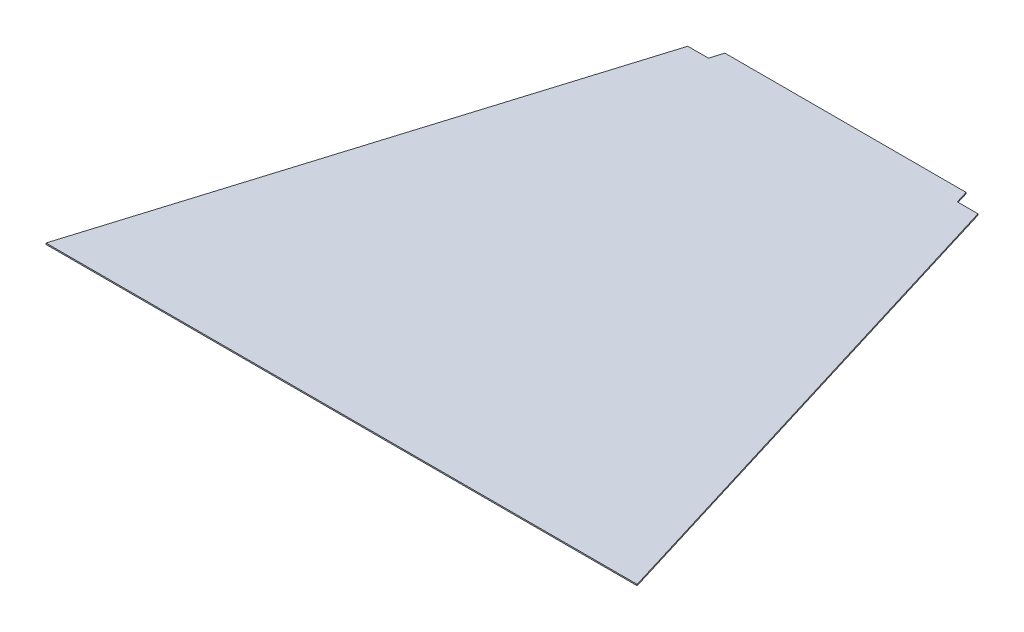
ISO-10303-21;
HEADER;
FILE_DESCRIPTION(('STEP AP214'),'2;1');
FILE_NAME('part.step','',(''),(''),'','','');
FILE_SCHEMA(('AUTOMOTIVE_DESIGN { 1 0 10303 214 1 1 1 1 }'));
ENDSEC;
DATA;
#1=APPLICATION_CONTEXT('core data for automotive mechanical design processes');
#2=APPLICATION_PROTOCOL_DEFINITION('international standard','automotive_design',2000,#1);
#3=PRODUCT_CONTEXT('',#1,'mechanical');
#4=PRODUCT('Part','Part','',(#3));
#5=PRODUCT_RELATED_PRODUCT_CATEGORY('part','',(#4));
#6=PRODUCT_DEFINITION_FORMATION('','',#4);
#7=PRODUCT_DEFINITION_CONTEXT('part definition',#1,'design');
#8=PRODUCT_DEFINITION('design','',#6,#7);
#9=PRODUCT_DEFINITION_SHAPE('','',#8);
#10=(LENGTH_UNIT() NAMED_UNIT(*) SI_UNIT(.MILLI.,.METRE.));
#11=(NAMED_UNIT(*) PLANE_ANGLE_UNIT() SI_UNIT($,.RADIAN.));
#12=(NAMED_UNIT(*) SI_UNIT($,.STERADIAN.) SOLID_ANGLE_UNIT());
#13=UNCERTAINTY_MEASURE_WITH_UNIT(LENGTH_MEASURE(1.E-05),#10,'distance_accuracy_value','');
#14=(GEOMETRIC_REPRESENTATION_CONTEXT(3) GLOBAL_UNCERTAINTY_ASSIGNED_CONTEXT((#13)) GLOBAL_UNIT_ASSIGNED_CONTEXT((#10,
#11,#12)) REPRESENTATION_CONTEXT('',''));
#15=CARTESIAN_POINT('',(0.,0.,0.));
#16=DIRECTION('',(0.,0.,1.));
#17=DIRECTION('',(1.,0.,0.));
#18=AXIS2_PLACEMENT_3D('',#15,#16,#17);
#19=CARTESIAN_POINT('',(151.324264348355,1.5875,-16.1336290315275));
#20=DIRECTION('',(0.,0.,1.));
#21=DIRECTION('',(1.,0.,0.));
#22=AXIS2_PLACEMENT_3D('',#19,#20,#21);
#23=PLANE('',#22);
#24=DIRECTION('',(-1.,0.,0.));
#25=VECTOR('',#24,1.);
#26=CARTESIAN_POINT('',(151.324264348355,0.,-16.1336290315275));
#27=LINE('',#26,#25);
#28=CARTESIAN_POINT('',(177.232264348355,0.,-16.1336290315275));
#29=VERTEX_POINT('',#28);
#30=CARTESIAN_POINT('',(151.324264348355,0.,-16.1336290315275));
#31=VERTEX_POINT('',#30);
#32=EDGE_CURVE('E132',#29,#31,#27,.T.);
#33=ORIENTED_EDGE('',*,*,#32,.T.);
#34=DIRECTION('',(0.,-1.,0.));
#35=VECTOR('',#34,1.);
#36=CARTESIAN_POINT('',(151.324264348355,1.5875,-16.1336290315275));
#37=LINE('',#36,#35);
#38=CARTESIAN_POINT('',(151.324264348355,1.5875,-16.1336290315275));
#39=VERTEX_POINT('',#38);
#40=EDGE_CURVE('E11',#39,#31,#37,.T.);
#41=ORIENTED_EDGE('',*,*,#40,.F.);
#42=DIRECTION('',(-1.,0.,0.));
#43=VECTOR('',#42,1.);
#44=CARTESIAN_POINT('',(151.324264348355,1.5875,-16.1336290315275));
#45=LINE('',#44,#43);
#46=CARTESIAN_POINT('',(177.232264348355,1.5875,-16.1336290315275));
#47=VERTEX_POINT('',#46);
#48=EDGE_CURVE('E146',#47,#39,#45,.T.);
#49=ORIENTED_EDGE('',*,*,#48,.F.);
#50=DIRECTION('',(0.,-1.,0.));
#51=VECTOR('',#50,1.);
#52=CARTESIAN_POINT('',(177.232264348355,1.5875,-16.1336290315275));
#53=LINE('',#52,#51);
#54=EDGE_CURVE('E128',#47,#29,#53,.T.);
#55=ORIENTED_EDGE('',*,*,#54,.T.);
#56=EDGE_LOOP('',(#33,#41,#49,#55));
#57=FACE_BOUND('',#56,.T.);
#58=ADVANCED_FACE('F36',(#57),#23,.F.);
#59=CARTESIAN_POINT('',(151.324264348355,1.5875,-16.1336290315275));
#60=DIRECTION('',(-0.956162432926608,0.,0.292836817801093));
#61=DIRECTION('',(0.292836817801093,0.,0.956162432926608));
#62=AXIS2_PLACEMENT_3D('',#59,#60,#61);
#63=PLANE('',#62);
#64=DIRECTION('',(-0.292836817801093,0.,-0.956162432926608));
#65=VECTOR('',#64,1.);
#66=CARTESIAN_POINT('',(151.324264348355,0.,-16.1336290315275));
#67=LINE('',#66,#65);
#68=CARTESIAN_POINT('',(146.489528486459,0.,-31.9198707991457));
#69=VERTEX_POINT('',#68);
#70=EDGE_CURVE('E135',#31,#69,#67,.T.);
#71=ORIENTED_EDGE('',*,*,#70,.T.);
#72=DIRECTION('',(0.,-1.,0.));
#73=VECTOR('',#72,1.);
#74=CARTESIAN_POINT('',(146.489528486459,1.5875,-31.9198707991457));
#75=LINE('',#74,#73);
#76=CARTESIAN_POINT('',(146.489528486459,1.5875,-31.9198707991457));
#77=VERTEX_POINT('',#76);
#78=EDGE_CURVE('E44',#77,#69,#75,.T.);
#79=ORIENTED_EDGE('',*,*,#78,.F.);
#80=DIRECTION('',(-0.292836817801093,0.,-0.956162432926608));
#81=VECTOR('',#80,1.);
#82=CARTESIAN_POINT('',(151.324264348355,1.5875,-16.1336290315275));
#83=LINE('',#82,#81);
#84=EDGE_CURVE('E95',#39,#77,#83,.T.);
#85=ORIENTED_EDGE('',*,*,#84,.F.);
#86=ORIENTED_EDGE('',*,*,#40,.T.);
#87=EDGE_LOOP('',(#71,#79,#85,#86));
#88=FACE_BOUND('',#87,.T.);
#89=ADVANCED_FACE('F181',(#88),#63,.F.);
#90=CARTESIAN_POINT('',(-155.658099375668,1.5875,-31.9198707991457));
#91=DIRECTION('',(0.,0.,1.));
#92=DIRECTION('',(1.,0.,0.));
#93=AXIS2_PLACEMENT_3D('',#90,#91,#92);
#94=PLANE('',#93);
#95=DIRECTION('',(-1.,0.,0.));
#96=VECTOR('',#95,1.);
#97=CARTESIAN_POINT('',(-155.658099375668,0.,-31.9198707991457));
#98=LINE('',#97,#96);
#99=CARTESIAN_POINT('',(-155.658099375668,0.,-31.9198707991457));
#100=VERTEX_POINT('',#99);
#101=EDGE_CURVE('E137',#69,#100,#98,.T.);
#102=ORIENTED_EDGE('',*,*,#101,.T.);
#103=DIRECTION('',(0.,-1.,0.));
#104=VECTOR('',#103,1.);
#105=CARTESIAN_POINT('',(-155.658099375668,1.5875,-31.9198707991457));
#106=LINE('',#105,#104);
#107=CARTESIAN_POINT('',(-155.658099375668,1.5875,-31.9198707991457));
#108=VERTEX_POINT('',#107);
#109=EDGE_CURVE('E153',#108,#100,#106,.T.);
#110=ORIENTED_EDGE('',*,*,#109,.F.);
#111=DIRECTION('',(-1.,0.,0.));
#112=VECTOR('',#111,1.);
#113=CARTESIAN_POINT('',(-155.658099375668,1.5875,-31.9198707991457));
#114=LINE('',#113,#112);
#115=EDGE_CURVE('E161',#77,#108,#114,.T.);
#116=ORIENTED_EDGE('',*,*,#115,.F.);
#117=ORIENTED_EDGE('',*,*,#78,.T.);
#118=EDGE_LOOP('',(#102,#110,#116,#117));
#119=FACE_BOUND('',#118,.T.);
#120=ADVANCED_FACE('F159',(#119),#94,.F.);
#121=CARTESIAN_POINT('',(-160.492835237564,1.5875,-16.1336290315274));
#122=DIRECTION('',(0.956162432926608,0.,0.292836817801093));
#123=DIRECTION('',(0.292836817801093,0.,-0.956162432926608));
#124=AXIS2_PLACEMENT_3D('',#121,#122,#123);
#125=PLANE('',#124);
#126=DIRECTION('',(-0.292836817801093,0.,0.956162432926608));
#127=VECTOR('',#126,1.);
#128=CARTESIAN_POINT('',(-160.492835237564,0.,-16.1336290315274));
#129=LINE('',#128,#127);
#130=CARTESIAN_POINT('',(-160.492835237564,0.,-16.1336290315274));
#131=VERTEX_POINT('',#130);
#132=EDGE_CURVE('E139',#100,#131,#129,.T.);
#133=ORIENTED_EDGE('',*,*,#132,.T.);
#134=DIRECTION('',(0.,-1.,0.));
#135=VECTOR('',#134,1.);
#136=CARTESIAN_POINT('',(-160.492835237564,1.5875,-16.1336290315274));
#137=LINE('',#136,#135);
#138=CARTESIAN_POINT('',(-160.492835237564,1.5875,-16.1336290315274));
#139=VERTEX_POINT('',#138);
#140=EDGE_CURVE('E150',#139,#131,#137,.T.);
#141=ORIENTED_EDGE('',*,*,#140,.F.);
#142=DIRECTION('',(-0.292836817801093,0.,0.956162432926608));
#143=VECTOR('',#142,1.);
#144=CARTESIAN_POINT('',(-160.492835237564,1.5875,-16.1336290315274));
#145=LINE('',#144,#143);
#146=EDGE_CURVE('E173',#108,#139,#145,.T.);
#147=ORIENTED_EDGE('',*,*,#146,.F.);
#148=ORIENTED_EDGE('',*,*,#109,.T.);
#149=EDGE_LOOP('',(#133,#141,#147,#148));
#150=FACE_BOUND('',#149,.T.);
#151=ADVANCED_FACE('F169',(#150),#125,.F.);
#152=CARTESIAN_POINT('',(-186.400835237564,1.5875,-16.1336290315274));
#153=DIRECTION('',(0.,0.,1.));
#154=DIRECTION('',(1.,0.,0.));
#155=AXIS2_PLACEMENT_3D('',#152,#153,#154);
#156=PLANE('',#155);
#157=DIRECTION('',(-1.,0.,0.));
#158=VECTOR('',#157,1.);
#159=CARTESIAN_POINT('',(-186.400835237564,0.,-16.1336290315274));
#160=LINE('',#159,#158);
#161=CARTESIAN_POINT('',(-186.400835237564,0.,-16.1336290315274));
#162=VERTEX_POINT('',#161);
#163=EDGE_CURVE('E141',#131,#162,#160,.T.);
#164=ORIENTED_EDGE('',*,*,#163,.T.);
#165=DIRECTION('',(0.,-1.,0.));
#166=VECTOR('',#165,1.);
#167=CARTESIAN_POINT('',(-186.400835237564,1.5875,-16.1336290315274));
#168=LINE('',#167,#166);
#169=CARTESIAN_POINT('',(-186.400835237564,1.5875,-16.1336290315274));
#170=VERTEX_POINT('',#169);
#171=EDGE_CURVE('E123',#170,#162,#168,.T.);
#172=ORIENTED_EDGE('',*,*,#171,.F.);
#173=DIRECTION('',(-1.,0.,0.));
#174=VECTOR('',#173,1.);
#175=CARTESIAN_POINT('',(-186.400835237564,1.5875,-16.1336290315274));
#176=LINE('',#175,#174);
#177=EDGE_CURVE('E114',#139,#170,#176,.T.);
#178=ORIENTED_EDGE('',*,*,#177,.F.);
#179=ORIENTED_EDGE('',*,*,#140,.T.);
#180=EDGE_LOOP('',(#164,#172,#178,#179));
#181=FACE_BOUND('',#180,.T.);
#182=ADVANCED_FACE('F172',(#181),#156,.F.);
#183=CARTESIAN_POINT('',(-186.400835237564,1.5875,-16.1336290315274));
#184=DIRECTION('',(0.956162432926608,0.,0.292836817801093));
#185=DIRECTION('',(0.292836817801093,0.,-0.956162432926608));
#186=AXIS2_PLACEMENT_3D('',#183,#184,#185);
#187=PLANE('',#186);
#188=DIRECTION('',(-0.292836817801093,0.,0.956162432926608));
#189=VECTOR('',#188,1.);
#190=CARTESIAN_POINT('',(-186.400835237564,0.,-16.1336290315274));
#191=LINE('',#190,#189);
#192=CARTESIAN_POINT('',(-374.916285391402,0.,599.401646952051));
#193=VERTEX_POINT('',#192);
#194=EDGE_CURVE('E122',#162,#193,#191,.T.);
#195=ORIENTED_EDGE('',*,*,#194,.T.);
#196=DIRECTION('',(0.,-1.,0.));
#197=VECTOR('',#196,1.);
#198=CARTESIAN_POINT('',(-374.916285391402,1.5875,599.401646952051));
#199=LINE('',#198,#197);
#200=CARTESIAN_POINT('',(-374.916285391402,1.5875,599.401646952051));
#201=VERTEX_POINT('',#200);
#202=EDGE_CURVE('E119',#201,#193,#199,.T.);
#203=ORIENTED_EDGE('',*,*,#202,.F.);
#204=DIRECTION('',(-0.292836817801093,0.,0.956162432926608));
#205=VECTOR('',#204,1.);
#206=CARTESIAN_POINT('',(-186.400835237564,1.5875,-16.1336290315274));
#207=LINE('',#206,#205);
#208=EDGE_CURVE('E108',#170,#201,#207,.T.);
#209=ORIENTED_EDGE('',*,*,#208,.F.);
#210=ORIENTED_EDGE('',*,*,#171,.T.);
#211=EDGE_LOOP('',(#195,#203,#209,#210));
#212=FACE_BOUND('',#211,.T.);
#213=ADVANCED_FACE('F120',(#212),#187,.F.);
#214=CARTESIAN_POINT('',(-374.916285391402,1.5875,599.401646952051));
#215=DIRECTION('',(0.,0.,-1.));
#216=DIRECTION('',(-1.,0.,0.));
#217=AXIS2_PLACEMENT_3D('',#214,#215,#216);
#218=PLANE('',#217);
#219=DIRECTION('',(1.,0.,0.));
#220=VECTOR('',#219,1.);
#221=CARTESIAN_POINT('',(-374.916285391402,0.,599.401646952051));
#222=LINE('',#221,#220);
#223=CARTESIAN_POINT('',(365.747714502194,0.,599.401646952051));
#224=VERTEX_POINT('',#223);
#225=EDGE_CURVE('E81',#193,#224,#222,.T.);
#226=ORIENTED_EDGE('',*,*,#225,.T.);
#227=DIRECTION('',(0.,-1.,0.));
#228=VECTOR('',#227,1.);
#229=CARTESIAN_POINT('',(365.747714502194,1.5875,599.401646952051));
#230=LINE('',#229,#228);
#231=CARTESIAN_POINT('',(365.747714502194,1.5875,599.401646952051));
#232=VERTEX_POINT('',#231);
#233=EDGE_CURVE('E124',#232,#224,#230,.T.);
#234=ORIENTED_EDGE('',*,*,#233,.F.);
#235=DIRECTION('',(1.,0.,0.));
#236=VECTOR('',#235,1.);
#237=CARTESIAN_POINT('',(-374.916285391402,1.5875,599.401646952051));
#238=LINE('',#237,#236);
#239=EDGE_CURVE('E112',#201,#232,#238,.T.);
#240=ORIENTED_EDGE('',*,*,#239,.F.);
#241=ORIENTED_EDGE('',*,*,#202,.T.);
#242=EDGE_LOOP('',(#226,#234,#240,#241));
#243=FACE_BOUND('',#242,.T.);
#244=ADVANCED_FACE('F126',(#243),#218,.F.);
#245=CARTESIAN_POINT('',(177.232264348355,1.5875,-16.1336290315275));
#246=DIRECTION('',(-0.956162432926608,0.,0.292836817801094));
#247=DIRECTION('',(0.292836817801094,0.,0.956162432926607));
#248=AXIS2_PLACEMENT_3D('',#245,#246,#247);
#249=PLANE('',#248);
#250=DIRECTION('',(-0.292836817801094,0.,-0.956162432926607));
#251=VECTOR('',#250,1.);
#252=CARTESIAN_POINT('',(177.232264348355,0.,-16.1336290315275));
#253=LINE('',#252,#251);
#254=EDGE_CURVE('E87',#224,#29,#253,.T.);
#255=ORIENTED_EDGE('',*,*,#254,.T.);
#256=ORIENTED_EDGE('',*,*,#54,.F.);
#257=DIRECTION('',(-0.292836817801094,0.,-0.956162432926607));
#258=VECTOR('',#257,1.);
#259=CARTESIAN_POINT('',(177.232264348355,1.5875,-16.1336290315275));
#260=LINE('',#259,#258);
#261=EDGE_CURVE('E52',#232,#47,#260,.T.);
#262=ORIENTED_EDGE('',*,*,#261,.F.);
#263=ORIENTED_EDGE('',*,*,#233,.T.);
#264=EDGE_LOOP('',(#255,#256,#262,#263));
#265=FACE_BOUND('',#264,.T.);
#266=ADVANCED_FACE('F197',(#265),#249,.F.);
#267=CARTESIAN_POINT('',(0.,1.5875,0.));
#268=DIRECTION('',(0.,-1.,0.));
#269=DIRECTION('',(0.,0.,-1.));
#270=AXIS2_PLACEMENT_3D('',#267,#268,#269);
#271=PLANE('',#270);
#272=ORIENTED_EDGE('',*,*,#48,.T.);
#273=ORIENTED_EDGE('',*,*,#84,.T.);
#274=ORIENTED_EDGE('',*,*,#115,.T.);
#275=ORIENTED_EDGE('',*,*,#146,.T.);
#276=ORIENTED_EDGE('',*,*,#177,.T.);
#277=ORIENTED_EDGE('',*,*,#208,.T.);
#278=ORIENTED_EDGE('',*,*,#239,.T.);
#279=ORIENTED_EDGE('',*,*,#261,.T.);
#280=EDGE_LOOP('',(#272,#273,#274,#275,#276,#277,#278,#279));
#281=FACE_BOUND('',#280,.T.);
#282=ADVANCED_FACE('F110',(#281),#271,.F.);
#283=CARTESIAN_POINT('',(0.,0.,0.));
#284=DIRECTION('',(0.,-1.,0.));
#285=DIRECTION('',(0.,0.,-1.));
#286=AXIS2_PLACEMENT_3D('',#283,#284,#285);
#287=PLANE('',#286);
#288=ORIENTED_EDGE('',*,*,#32,.F.);
#289=ORIENTED_EDGE('',*,*,#254,.F.);
#290=ORIENTED_EDGE('',*,*,#225,.F.);
#291=ORIENTED_EDGE('',*,*,#194,.F.);
#292=ORIENTED_EDGE('',*,*,#163,.F.);
#293=ORIENTED_EDGE('',*,*,#132,.F.);
#294=ORIENTED_EDGE('',*,*,#101,.F.);
#295=ORIENTED_EDGE('',*,*,#70,.F.);
#296=EDGE_LOOP('',(#288,#289,#290,#291,#292,#293,#294,#295));
#297=FACE_BOUND('',#296,.T.);
#298=ADVANCED_FACE('F165',(#297),#287,.T.);
#299=CLOSED_SHELL('',(#58,#89,#120,#151,#182,#213,#244,#266,#282,#298));
#300=MANIFOLD_SOLID_BREP('B2',#299);
#301=ADVANCED_BREP_SHAPE_REPRESENTATION('',(#18,#300),#14);
#302=SHAPE_DEFINITION_REPRESENTATION(#9,#301);
ENDSEC;
END-ISO-10303-21;
